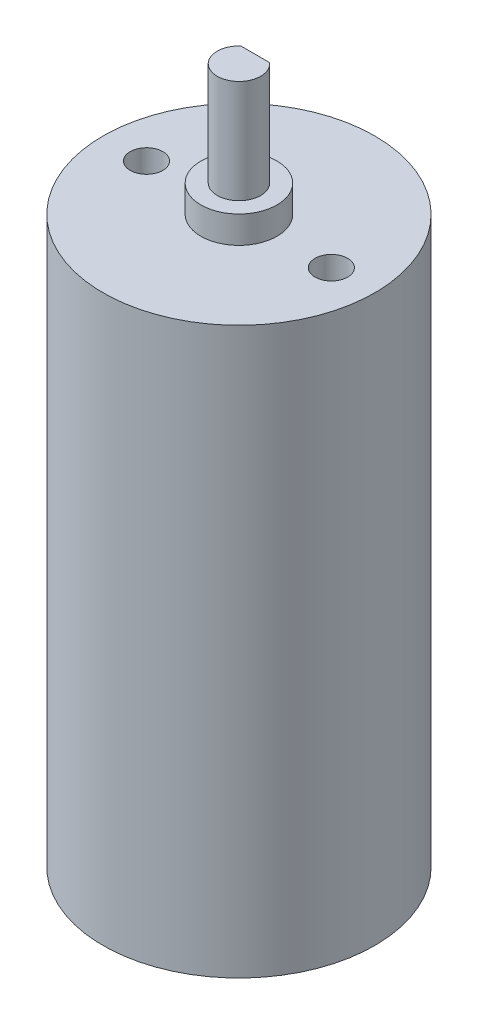
ISO-10303-21;
HEADER;
FILE_DESCRIPTION(('STEP AP214'),'2;1');
FILE_NAME('part.step','',(''),(''),'','','');
FILE_SCHEMA(('AUTOMOTIVE_DESIGN { 1 0 10303 214 1 1 1 1 }'));
ENDSEC;
DATA;
#1=APPLICATION_CONTEXT('core data for automotive mechanical design processes');
#2=APPLICATION_PROTOCOL_DEFINITION('international standard','automotive_design',2000,#1);
#3=PRODUCT_CONTEXT('',#1,'mechanical');
#4=PRODUCT('Part','Part','',(#3));
#5=PRODUCT_RELATED_PRODUCT_CATEGORY('part','',(#4));
#6=PRODUCT_DEFINITION_FORMATION('','',#4);
#7=PRODUCT_DEFINITION_CONTEXT('part definition',#1,'design');
#8=PRODUCT_DEFINITION('design','',#6,#7);
#9=PRODUCT_DEFINITION_SHAPE('','',#8);
#10=(LENGTH_UNIT() NAMED_UNIT(*) SI_UNIT(.MILLI.,.METRE.));
#11=(NAMED_UNIT(*) PLANE_ANGLE_UNIT() SI_UNIT($,.RADIAN.));
#12=(NAMED_UNIT(*) SI_UNIT($,.STERADIAN.) SOLID_ANGLE_UNIT());
#13=UNCERTAINTY_MEASURE_WITH_UNIT(LENGTH_MEASURE(1.E-05),#10,'distance_accuracy_value','');
#14=(GEOMETRIC_REPRESENTATION_CONTEXT(3) GLOBAL_UNCERTAINTY_ASSIGNED_CONTEXT((#13)) GLOBAL_UNIT_ASSIGNED_CONTEXT((#10,
#11,#12)) REPRESENTATION_CONTEXT('',''));
#15=CARTESIAN_POINT('',(0.,0.,0.));
#16=DIRECTION('',(0.,0.,1.));
#17=DIRECTION('',(1.,0.,0.));
#18=AXIS2_PLACEMENT_3D('',#15,#16,#17);
#19=CARTESIAN_POINT('',(0.,52.,0.));
#20=DIRECTION('',(0.,1.,0.));
#21=DIRECTION('',(0.,0.,1.));
#22=AXIS2_PLACEMENT_3D('',#19,#20,#21);
#23=PLANE('',#22);
#24=CARTESIAN_POINT('',(8.5,52.,0.));
#25=DIRECTION('',(0.,1.,0.));
#26=DIRECTION('',(0.,0.,1.));
#27=AXIS2_PLACEMENT_3D('',#24,#25,#26);
#28=CIRCLE('',#27,1.5);
#29=CARTESIAN_POINT('',(8.5,52.,1.5));
#30=VERTEX_POINT('',#29);
#31=EDGE_CURVE('E165',#30,#30,#28,.F.);
#32=ORIENTED_EDGE('',*,*,#31,.T.);
#33=EDGE_LOOP('',(#32));
#34=FACE_BOUND('',#33,.T.);
#35=CARTESIAN_POINT('',(0.,52.,0.));
#36=DIRECTION('',(0.,1.,0.));
#37=DIRECTION('',(0.,0.,1.));
#38=AXIS2_PLACEMENT_3D('',#35,#36,#37);
#39=CIRCLE('',#38,3.5);
#40=CARTESIAN_POINT('',(0.,52.,3.5));
#41=VERTEX_POINT('',#40);
#42=EDGE_CURVE('E11',#41,#41,#39,.T.);
#43=ORIENTED_EDGE('',*,*,#42,.F.);
#44=EDGE_LOOP('',(#43));
#45=FACE_BOUND('',#44,.T.);
#46=CARTESIAN_POINT('',(0.,52.,0.));
#47=DIRECTION('',(0.,1.,0.));
#48=DIRECTION('',(0.,0.,1.));
#49=AXIS2_PLACEMENT_3D('',#46,#47,#48);
#50=CIRCLE('',#49,12.5);
#51=CARTESIAN_POINT('',(0.,52.,-12.5));
#52=VERTEX_POINT('',#51);
#53=EDGE_CURVE('E51',#52,#52,#50,.T.);
#54=ORIENTED_EDGE('',*,*,#53,.T.);
#55=EDGE_LOOP('',(#54));
#56=FACE_BOUND('',#55,.T.);
#57=CARTESIAN_POINT('',(-8.5,52.,0.));
#58=DIRECTION('',(0.,1.,0.));
#59=DIRECTION('',(0.,0.,1.));
#60=AXIS2_PLACEMENT_3D('',#57,#58,#59);
#61=CIRCLE('',#60,1.5);
#62=CARTESIAN_POINT('',(-8.5,52.,1.5));
#63=VERTEX_POINT('',#62);
#64=EDGE_CURVE('E155',#63,#63,#61,.T.);
#65=ORIENTED_EDGE('',*,*,#64,.F.);
#66=EDGE_LOOP('',(#65));
#67=FACE_BOUND('',#66,.T.);
#68=ADVANCED_FACE('F41',(#34,#45,#56,#67),#23,.T.);
#69=CARTESIAN_POINT('',(0.,52.,0.));
#70=DIRECTION('',(0.,-1.,0.));
#71=DIRECTION('',(0.,0.,-1.));
#72=AXIS2_PLACEMENT_3D('',#69,#70,#71);
#73=CYLINDRICAL_SURFACE('',#72,12.5);
#74=CARTESIAN_POINT('',(0.,0.,0.));
#75=DIRECTION('',(0.,1.,0.));
#76=DIRECTION('',(0.,0.,1.));
#77=AXIS2_PLACEMENT_3D('',#74,#75,#76);
#78=CIRCLE('',#77,12.5);
#79=CARTESIAN_POINT('',(0.,0.,-12.5));
#80=VERTEX_POINT('',#79);
#81=EDGE_CURVE('E45',#80,#80,#78,.T.);
#82=CARTESIAN_POINT('',(0.,52.,-12.5));
#83=CARTESIAN_POINT('',(0.,51.4583333333333,-12.5));
#84=CARTESIAN_POINT('',(0.,50.9166666666667,-12.5));
#85=CARTESIAN_POINT('',(0.,49.8333333333333,-12.5));
#86=CARTESIAN_POINT('',(0.,49.2916666666667,-12.5));
#87=CARTESIAN_POINT('',(0.,48.2083333333333,-12.5));
#88=CARTESIAN_POINT('',(0.,47.6666666666667,-12.5));
#89=CARTESIAN_POINT('',(0.,46.5833333333333,-12.5));
#90=CARTESIAN_POINT('',(0.,46.0416666666667,-12.5));
#91=CARTESIAN_POINT('',(0.,44.9583333333333,-12.5));
#92=CARTESIAN_POINT('',(0.,44.4166666666667,-12.5));
#93=CARTESIAN_POINT('',(0.,43.3333333333333,-12.5));
#94=CARTESIAN_POINT('',(0.,42.7916666666667,-12.5));
#95=CARTESIAN_POINT('',(0.,41.7083333333333,-12.5));
#96=CARTESIAN_POINT('',(0.,41.1666666666667,-12.5));
#97=CARTESIAN_POINT('',(0.,40.0833333333333,-12.5));
#98=CARTESIAN_POINT('',(0.,39.5416666666667,-12.5));
#99=CARTESIAN_POINT('',(0.,38.4583333333333,-12.5));
#100=CARTESIAN_POINT('',(0.,37.9166666666667,-12.5));
#101=CARTESIAN_POINT('',(0.,36.8333333333333,-12.5));
#102=CARTESIAN_POINT('',(0.,36.2916666666667,-12.5));
#103=CARTESIAN_POINT('',(0.,35.2083333333333,-12.5));
#104=CARTESIAN_POINT('',(0.,34.6666666666667,-12.5));
#105=CARTESIAN_POINT('',(0.,33.5833333333333,-12.5));
#106=CARTESIAN_POINT('',(0.,33.0416666666667,-12.5));
#107=CARTESIAN_POINT('',(0.,31.9583333333333,-12.5));
#108=CARTESIAN_POINT('',(0.,31.4166666666667,-12.5));
#109=CARTESIAN_POINT('',(0.,30.3333333333333,-12.5));
#110=CARTESIAN_POINT('',(0.,29.7916666666667,-12.5));
#111=CARTESIAN_POINT('',(0.,28.7083333333333,-12.5));
#112=CARTESIAN_POINT('',(0.,28.1666666666667,-12.5));
#113=CARTESIAN_POINT('',(0.,27.0833333333333,-12.5));
#114=CARTESIAN_POINT('',(0.,26.5416666666667,-12.5));
#115=CARTESIAN_POINT('',(0.,25.4583333333333,-12.5));
#116=CARTESIAN_POINT('',(0.,24.9166666666667,-12.5));
#117=CARTESIAN_POINT('',(0.,23.8333333333333,-12.5));
#118=CARTESIAN_POINT('',(0.,23.2916666666667,-12.5));
#119=CARTESIAN_POINT('',(0.,22.2083333333333,-12.5));
#120=CARTESIAN_POINT('',(0.,21.6666666666667,-12.5));
#121=CARTESIAN_POINT('',(0.,20.5833333333333,-12.5));
#122=CARTESIAN_POINT('',(0.,20.0416666666667,-12.5));
#123=CARTESIAN_POINT('',(0.,18.9583333333333,-12.5));
#124=CARTESIAN_POINT('',(0.,18.4166666666667,-12.5));
#125=CARTESIAN_POINT('',(0.,17.3333333333333,-12.5));
#126=CARTESIAN_POINT('',(0.,16.7916666666667,-12.5));
#127=CARTESIAN_POINT('',(0.,15.7083333333333,-12.5));
#128=CARTESIAN_POINT('',(0.,15.1666666666667,-12.5));
#129=CARTESIAN_POINT('',(0.,14.0833333333333,-12.5));
#130=CARTESIAN_POINT('',(0.,13.5416666666667,-12.5));
#131=CARTESIAN_POINT('',(0.,12.4583333333333,-12.5));
#132=CARTESIAN_POINT('',(0.,11.9166666666667,-12.5));
#133=CARTESIAN_POINT('',(0.,10.8333333333333,-12.5));
#134=CARTESIAN_POINT('',(0.,10.2916666666667,-12.5));
#135=CARTESIAN_POINT('',(0.,9.20833333333333,-12.5));
#136=CARTESIAN_POINT('',(0.,8.66666666666667,-12.5));
#137=CARTESIAN_POINT('',(0.,7.58333333333333,-12.5));
#138=CARTESIAN_POINT('',(0.,7.04166666666667,-12.5));
#139=CARTESIAN_POINT('',(0.,5.95833333333333,-12.5));
#140=CARTESIAN_POINT('',(0.,5.41666666666667,-12.5));
#141=CARTESIAN_POINT('',(0.,4.33333333333333,-12.5));
#142=CARTESIAN_POINT('',(0.,3.79166666666667,-12.5));
#143=CARTESIAN_POINT('',(0.,2.70833333333334,-12.5));
#144=CARTESIAN_POINT('',(0.,2.16666666666667,-12.5));
#145=CARTESIAN_POINT('',(0.,1.08333333333333,-12.5));
#146=CARTESIAN_POINT('',(0.,0.541666666666667,-12.5));
#147=CARTESIAN_POINT('',(0.,0.,-12.5));
#148=B_SPLINE_CURVE_WITH_KNOTS('',3,(#82,#83,#84,#85,#86,#87,#88,#89,#90,#91,#92,#93,#94,#95,
#96,#97,#98,#99,#100,#101,#102,#103,#104,#105,#106,#107,#108,#109,#110,#111,#112,#113,#114,#115,
#116,#117,#118,#119,#120,#121,#122,#123,#124,#125,#126,#127,#128,#129,#130,#131,#132,#133,#134,
#135,#136,#137,#138,#139,#140,#141,#142,#143,#144,#145,#146,#147),.UNSPECIFIED.,.F.,.F.,(4,2,2,
2,2,2,2,2,2,2,2,2,2,2,2,2,2,2,2,2,2,2,2,2,2,2,2,2,2,2,2,2,4),(0.,1.625,3.25,4.875,
6.50000000000001,8.125,9.75,11.375,13.,14.625,16.25,17.875,19.5,21.125,22.75,24.375,26.,27.625,
29.25,30.875,32.5,34.125,35.75,37.375,39.,40.625,42.25,43.875,45.5,47.125,48.75,50.375,52.),.UNSPECIFIED.);
#149=EDGE_CURVE('BSEAM43',#52,#80,#148,.T.);
#150=ORIENTED_EDGE('',*,*,#53,.F.);
#151=ORIENTED_EDGE('',*,*,#81,.T.);
#152=ORIENTED_EDGE('',*,*,#149,.T.);
#153=ORIENTED_EDGE('',*,*,#149,.F.);
#154=EDGE_LOOP('',(#150,#152,#151,#153));
#155=FACE_BOUND('',#154,.T.);
#156=ADVANCED_FACE('F43',(#155),#73,.T.);
#157=CARTESIAN_POINT('',(0.,0.,0.));
#158=DIRECTION('',(0.,1.,0.));
#159=DIRECTION('',(0.,0.,1.));
#160=AXIS2_PLACEMENT_3D('',#157,#158,#159);
#161=PLANE('',#160);
#162=ORIENTED_EDGE('',*,*,#81,.F.);
#163=EDGE_LOOP('',(#162));
#164=FACE_BOUND('',#163,.T.);
#165=ADVANCED_FACE('F108',(#164),#161,.F.);
#166=CARTESIAN_POINT('',(0.,54.5,0.));
#167=DIRECTION('',(0.,-1.,0.));
#168=DIRECTION('',(0.,0.,-1.));
#169=AXIS2_PLACEMENT_3D('',#166,#167,#168);
#170=CYLINDRICAL_SURFACE('',#169,3.5);
#171=CARTESIAN_POINT('',(0.,54.5,0.));
#172=DIRECTION('',(0.,1.,0.));
#173=DIRECTION('',(0.,0.,1.));
#174=AXIS2_PLACEMENT_3D('',#171,#172,#173);
#175=CIRCLE('',#174,3.5);
#176=CARTESIAN_POINT('',(0.,54.5,3.5));
#177=VERTEX_POINT('',#176);
#178=EDGE_CURVE('E93',#177,#177,#175,.T.);
#179=ORIENTED_EDGE('',*,*,#178,.F.);
#180=EDGE_LOOP('',(#179));
#181=FACE_BOUND('',#180,.T.);
#182=ORIENTED_EDGE('',*,*,#42,.T.);
#183=EDGE_LOOP('',(#182));
#184=FACE_BOUND('',#183,.T.);
#185=ADVANCED_FACE('F110',(#181,#184),#170,.T.);
#186=CARTESIAN_POINT('',(0.,54.5,0.));
#187=DIRECTION('',(0.,1.,0.));
#188=DIRECTION('',(0.,0.,1.));
#189=AXIS2_PLACEMENT_3D('',#186,#187,#188);
#190=PLANE('',#189);
#191=DIRECTION('',(-1.,0.,0.));
#192=VECTOR('',#191,1.);
#193=CARTESIAN_POINT('',(0.,54.5,-1.5));
#194=LINE('',#193,#192);
#195=CARTESIAN_POINT('',(1.3228756555323,54.5,-1.5));
#196=VERTEX_POINT('',#195);
#197=CARTESIAN_POINT('',(-1.3228756555323,54.5,-1.5));
#198=VERTEX_POINT('',#197);
#199=EDGE_CURVE('E71',#196,#198,#194,.T.);
#200=ORIENTED_EDGE('',*,*,#199,.F.);
#201=CARTESIAN_POINT('',(0.,54.5,0.));
#202=DIRECTION('',(0.,1.,0.));
#203=DIRECTION('',(0.,0.,1.));
#204=AXIS2_PLACEMENT_3D('',#201,#202,#203);
#205=CIRCLE('',#204,2.);
#206=EDGE_CURVE('E58',#198,#196,#205,.T.);
#207=ORIENTED_EDGE('',*,*,#206,.F.);
#208=EDGE_LOOP('',(#200,#207));
#209=FACE_BOUND('',#208,.T.);
#210=ORIENTED_EDGE('',*,*,#178,.T.);
#211=EDGE_LOOP('',(#210));
#212=FACE_BOUND('',#211,.T.);
#213=ADVANCED_FACE('F72',(#209,#212),#190,.T.);
#214=CARTESIAN_POINT('',(0.,64.,-1.5));
#215=DIRECTION('',(0.,0.,1.));
#216=DIRECTION('',(1.,0.,0.));
#217=AXIS2_PLACEMENT_3D('',#214,#215,#216);
#218=PLANE('',#217);
#219=ORIENTED_EDGE('',*,*,#199,.T.);
#220=DIRECTION('',(0.,-1.,0.));
#221=VECTOR('',#220,1.);
#222=CARTESIAN_POINT('',(-1.3228756555323,64.,-1.5));
#223=LINE('',#222,#221);
#224=CARTESIAN_POINT('',(-1.3228756555323,64.,-1.5));
#225=VERTEX_POINT('',#224);
#226=EDGE_CURVE('E84',#225,#198,#223,.T.);
#227=ORIENTED_EDGE('',*,*,#226,.F.);
#228=DIRECTION('',(-1.,0.,0.));
#229=VECTOR('',#228,1.);
#230=CARTESIAN_POINT('',(0.,64.,-1.5));
#231=LINE('',#230,#229);
#232=CARTESIAN_POINT('',(1.3228756555323,64.,-1.5));
#233=VERTEX_POINT('',#232);
#234=EDGE_CURVE('E86',#233,#225,#231,.T.);
#235=ORIENTED_EDGE('',*,*,#234,.F.);
#236=DIRECTION('',(0.,-1.,0.));
#237=VECTOR('',#236,1.);
#238=CARTESIAN_POINT('',(1.3228756555323,64.,-1.5));
#239=LINE('',#238,#237);
#240=EDGE_CURVE('E82',#233,#196,#239,.T.);
#241=ORIENTED_EDGE('',*,*,#240,.T.);
#242=EDGE_LOOP('',(#219,#227,#235,#241));
#243=FACE_BOUND('',#242,.T.);
#244=ADVANCED_FACE('F88',(#243),#218,.F.);
#245=CARTESIAN_POINT('',(0.,64.,0.));
#246=DIRECTION('',(0.,-1.,0.));
#247=DIRECTION('',(0.,0.,-1.));
#248=AXIS2_PLACEMENT_3D('',#245,#246,#247);
#249=CYLINDRICAL_SURFACE('',#248,2.);
#250=ORIENTED_EDGE('',*,*,#206,.T.);
#251=ORIENTED_EDGE('',*,*,#240,.F.);
#252=CARTESIAN_POINT('',(0.,64.,0.));
#253=DIRECTION('',(0.,1.,0.));
#254=DIRECTION('',(0.,0.,1.));
#255=AXIS2_PLACEMENT_3D('',#252,#253,#254);
#256=CIRCLE('',#255,2.);
#257=EDGE_CURVE('E66',#225,#233,#256,.T.);
#258=ORIENTED_EDGE('',*,*,#257,.F.);
#259=ORIENTED_EDGE('',*,*,#226,.T.);
#260=EDGE_LOOP('',(#250,#251,#258,#259));
#261=FACE_BOUND('',#260,.T.);
#262=ADVANCED_FACE('F81',(#261),#249,.T.);
#263=CARTESIAN_POINT('',(0.,64.,0.));
#264=DIRECTION('',(0.,1.,0.));
#265=DIRECTION('',(0.,0.,1.));
#266=AXIS2_PLACEMENT_3D('',#263,#264,#265);
#267=PLANE('',#266);
#268=ORIENTED_EDGE('',*,*,#234,.T.);
#269=ORIENTED_EDGE('',*,*,#257,.T.);
#270=EDGE_LOOP('',(#268,#269));
#271=FACE_BOUND('',#270,.T.);
#272=ADVANCED_FACE('F132',(#271),#267,.T.);
#273=CARTESIAN_POINT('',(8.5,44.,0.));
#274=DIRECTION('',(0.,1.,0.));
#275=DIRECTION('',(0.,0.,1.));
#276=AXIS2_PLACEMENT_3D('',#273,#274,#275);
#277=CYLINDRICAL_SURFACE('',#276,1.5);
#278=CARTESIAN_POINT('',(8.5,44.,0.));
#279=DIRECTION('',(0.,1.,0.));
#280=DIRECTION('',(0.,0.,1.));
#281=AXIS2_PLACEMENT_3D('',#278,#279,#280);
#282=CIRCLE('',#281,1.5);
#283=CARTESIAN_POINT('',(8.5,44.,1.5));
#284=VERTEX_POINT('',#283);
#285=EDGE_CURVE('E159',#284,#284,#282,.F.);
#286=ORIENTED_EDGE('',*,*,#285,.T.);
#287=EDGE_LOOP('',(#286));
#288=FACE_BOUND('',#287,.T.);
#289=ORIENTED_EDGE('',*,*,#31,.F.);
#290=EDGE_LOOP('',(#289));
#291=FACE_BOUND('',#290,.T.);
#292=ADVANCED_FACE('F135',(#288,#291),#277,.F.);
#293=CARTESIAN_POINT('',(0.,44.,0.));
#294=DIRECTION('',(0.,1.,0.));
#295=DIRECTION('',(0.,0.,1.));
#296=AXIS2_PLACEMENT_3D('',#293,#294,#295);
#297=PLANE('',#296);
#298=ORIENTED_EDGE('',*,*,#285,.F.);
#299=EDGE_LOOP('',(#298));
#300=FACE_BOUND('',#299,.T.);
#301=ADVANCED_FACE('F138',(#300),#297,.T.);
#302=CARTESIAN_POINT('',(-8.5,44.,0.));
#303=DIRECTION('',(0.,1.,0.));
#304=DIRECTION('',(0.,0.,1.));
#305=AXIS2_PLACEMENT_3D('',#302,#303,#304);
#306=CYLINDRICAL_SURFACE('',#305,1.5);
#307=CARTESIAN_POINT('',(-8.5,44.,0.));
#308=DIRECTION('',(0.,1.,0.));
#309=DIRECTION('',(0.,0.,1.));
#310=AXIS2_PLACEMENT_3D('',#307,#308,#309);
#311=CIRCLE('',#310,1.5);
#312=CARTESIAN_POINT('',(-8.5,44.,1.5));
#313=VERTEX_POINT('',#312);
#314=EDGE_CURVE('E78',#313,#313,#311,.T.);
#315=ORIENTED_EDGE('',*,*,#314,.F.);
#316=EDGE_LOOP('',(#315));
#317=FACE_BOUND('',#316,.T.);
#318=ORIENTED_EDGE('',*,*,#64,.T.);
#319=EDGE_LOOP('',(#318));
#320=FACE_BOUND('',#319,.T.);
#321=ADVANCED_FACE('F142',(#317,#320),#306,.F.);
#322=CARTESIAN_POINT('',(0.,44.,0.));
#323=DIRECTION('',(0.,1.,0.));
#324=DIRECTION('',(0.,0.,1.));
#325=AXIS2_PLACEMENT_3D('',#322,#323,#324);
#326=PLANE('',#325);
#327=ORIENTED_EDGE('',*,*,#314,.T.);
#328=EDGE_LOOP('',(#327));
#329=FACE_BOUND('',#328,.T.);
#330=ADVANCED_FACE('F146',(#329),#326,.T.);
#331=CLOSED_SHELL('',(#68,#156,#165,#185,#213,#244,#262,#272,#292,#301,#321,#330));
#332=MANIFOLD_SOLID_BREP('B2',#331);
#333=ADVANCED_BREP_SHAPE_REPRESENTATION('',(#18,#332),#14);
#334=SHAPE_DEFINITION_REPRESENTATION(#9,#333);
ENDSEC;
END-ISO-10303-21;
